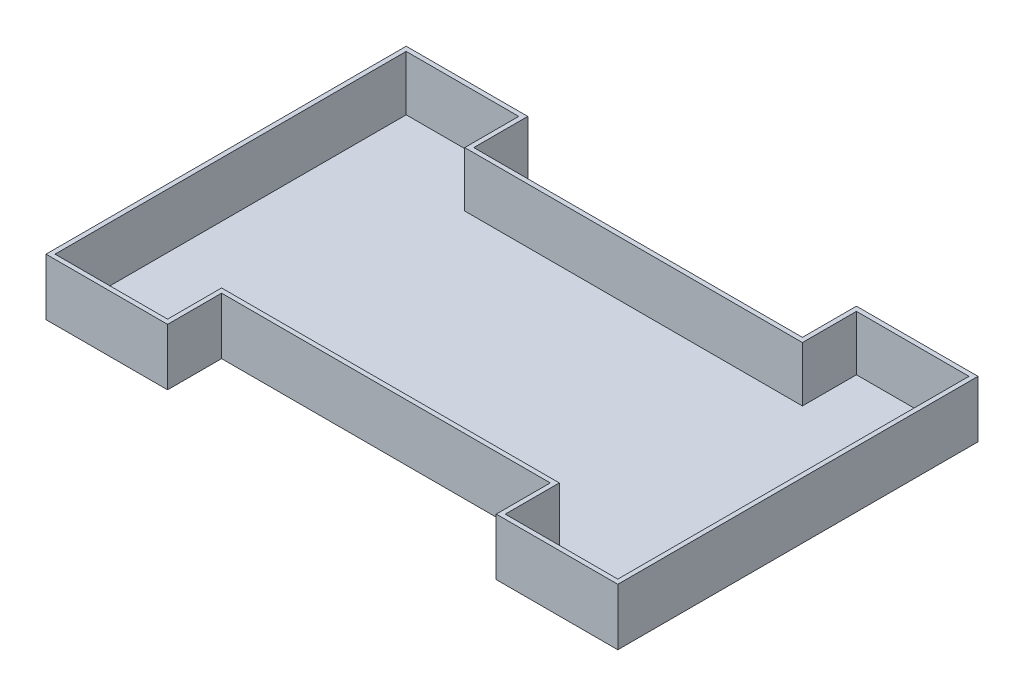
ISO-10303-21;
HEADER;
FILE_DESCRIPTION(('STEP AP214'),'2;1');
FILE_NAME('part.step','',(''),(''),'','','');
FILE_SCHEMA(('AUTOMOTIVE_DESIGN { 1 0 10303 214 1 1 1 1 }'));
ENDSEC;
DATA;
#1=APPLICATION_CONTEXT('core data for automotive mechanical design processes');
#2=APPLICATION_PROTOCOL_DEFINITION('international standard','automotive_design',2000,#1);
#3=PRODUCT_CONTEXT('',#1,'mechanical');
#4=PRODUCT('Part','Part','',(#3));
#5=PRODUCT_RELATED_PRODUCT_CATEGORY('part','',(#4));
#6=PRODUCT_DEFINITION_FORMATION('','',#4);
#7=PRODUCT_DEFINITION_CONTEXT('part definition',#1,'design');
#8=PRODUCT_DEFINITION('design','',#6,#7);
#9=PRODUCT_DEFINITION_SHAPE('','',#8);
#10=(LENGTH_UNIT() NAMED_UNIT(*) SI_UNIT(.MILLI.,.METRE.));
#11=(NAMED_UNIT(*) PLANE_ANGLE_UNIT() SI_UNIT($,.RADIAN.));
#12=(NAMED_UNIT(*) SI_UNIT($,.STERADIAN.) SOLID_ANGLE_UNIT());
#13=UNCERTAINTY_MEASURE_WITH_UNIT(LENGTH_MEASURE(1.E-05),#10,'distance_accuracy_value','');
#14=(GEOMETRIC_REPRESENTATION_CONTEXT(3) GLOBAL_UNCERTAINTY_ASSIGNED_CONTEXT((#13)) GLOBAL_UNIT_ASSIGNED_CONTEXT((#10,
#11,#12)) REPRESENTATION_CONTEXT('',''));
#15=CARTESIAN_POINT('',(0.,0.,0.));
#16=DIRECTION('',(0.,0.,1.));
#17=DIRECTION('',(1.,0.,0.));
#18=AXIS2_PLACEMENT_3D('',#15,#16,#17);
#19=CARTESIAN_POINT('',(403.225,2.54,254.));
#20=DIRECTION('',(0.,0.,-1.));
#21=DIRECTION('',(-1.,0.,0.));
#22=AXIS2_PLACEMENT_3D('',#19,#20,#21);
#23=PLANE('',#22);
#24=DIRECTION('',(1.,0.,0.));
#25=VECTOR('',#24,1.);
#26=CARTESIAN_POINT('',(403.225,0.,254.));
#27=LINE('',#26,#25);
#28=CARTESIAN_POINT('',(-403.225,0.,254.));
#29=VERTEX_POINT('',#28);
#30=CARTESIAN_POINT('',(-231.775,0.,254.));
#31=VERTEX_POINT('',#30);
#32=EDGE_CURVE('E366',#29,#31,#27,.T.);
#33=ORIENTED_EDGE('',*,*,#32,.T.);
#34=DIRECTION('',(0.,1.,0.));
#35=VECTOR('',#34,1.);
#36=CARTESIAN_POINT('',(-231.775,0.,254.));
#37=LINE('',#36,#35);
#38=CARTESIAN_POINT('',(-231.775,80.01,254.));
#39=VERTEX_POINT('',#38);
#40=EDGE_CURVE('E339',#31,#39,#37,.T.);
#41=ORIENTED_EDGE('',*,*,#40,.T.);
#42=DIRECTION('',(1.,0.,0.));
#43=VECTOR('',#42,1.);
#44=CARTESIAN_POINT('',(-403.225,80.01,254.));
#45=LINE('',#44,#43);
#46=CARTESIAN_POINT('',(-403.225,80.01,254.));
#47=VERTEX_POINT('',#46);
#48=EDGE_CURVE('E214',#47,#39,#45,.T.);
#49=ORIENTED_EDGE('',*,*,#48,.F.);
#50=DIRECTION('',(0.,-1.,0.));
#51=VECTOR('',#50,1.);
#52=CARTESIAN_POINT('',(-403.225,2.54,254.));
#53=LINE('',#52,#51);
#54=EDGE_CURVE('E11',#47,#29,#53,.T.);
#55=ORIENTED_EDGE('',*,*,#54,.T.);
#56=EDGE_LOOP('',(#33,#41,#49,#55));
#57=FACE_BOUND('',#56,.T.);
#58=ADVANCED_FACE('F39',(#57),#23,.F.);
#59=CARTESIAN_POINT('',(403.225,2.54,-254.));
#60=DIRECTION('',(0.,0.,1.));
#61=DIRECTION('',(1.,0.,0.));
#62=AXIS2_PLACEMENT_3D('',#59,#60,#61);
#63=PLANE('',#62);
#64=DIRECTION('',(-1.,0.,0.));
#65=VECTOR('',#64,1.);
#66=CARTESIAN_POINT('',(403.225,0.,-254.));
#67=LINE('',#66,#65);
#68=CARTESIAN_POINT('',(403.225,0.,-254.));
#69=VERTEX_POINT('',#68);
#70=CARTESIAN_POINT('',(231.775,0.,-254.));
#71=VERTEX_POINT('',#70);
#72=EDGE_CURVE('E372',#69,#71,#67,.T.);
#73=ORIENTED_EDGE('',*,*,#72,.T.);
#74=DIRECTION('',(0.,1.,0.));
#75=VECTOR('',#74,1.);
#76=CARTESIAN_POINT('',(231.775,0.,-254.));
#77=LINE('',#76,#75);
#78=CARTESIAN_POINT('',(231.775,80.01,-254.));
#79=VERTEX_POINT('',#78);
#80=EDGE_CURVE('E348',#71,#79,#77,.T.);
#81=ORIENTED_EDGE('',*,*,#80,.T.);
#82=DIRECTION('',(-1.,0.,0.));
#83=VECTOR('',#82,1.);
#84=CARTESIAN_POINT('',(403.225,80.01,-254.));
#85=LINE('',#84,#83);
#86=CARTESIAN_POINT('',(403.225,80.01,-254.));
#87=VERTEX_POINT('',#86);
#88=EDGE_CURVE('E310',#87,#79,#85,.T.);
#89=ORIENTED_EDGE('',*,*,#88,.F.);
#90=DIRECTION('',(0.,-1.,0.));
#91=VECTOR('',#90,1.);
#92=CARTESIAN_POINT('',(403.225,2.54,-254.));
#93=LINE('',#92,#91);
#94=EDGE_CURVE('E378',#87,#69,#93,.T.);
#95=ORIENTED_EDGE('',*,*,#94,.T.);
#96=EDGE_LOOP('',(#73,#81,#89,#95));
#97=FACE_BOUND('',#96,.T.);
#98=ADVANCED_FACE('F393',(#97),#63,.F.);
#99=CARTESIAN_POINT('',(-403.225,2.54,254.));
#100=DIRECTION('',(1.,0.,0.));
#101=DIRECTION('',(0.,0.,-1.));
#102=AXIS2_PLACEMENT_3D('',#99,#100,#101);
#103=PLANE('',#102);
#104=DIRECTION('',(0.,0.,1.));
#105=VECTOR('',#104,1.);
#106=CARTESIAN_POINT('',(-403.225,0.,254.));
#107=LINE('',#106,#105);
#108=CARTESIAN_POINT('',(-403.225,0.,-254.));
#109=VERTEX_POINT('',#108);
#110=EDGE_CURVE('E342',#109,#29,#107,.T.);
#111=ORIENTED_EDGE('',*,*,#110,.T.);
#112=ORIENTED_EDGE('',*,*,#54,.F.);
#113=DIRECTION('',(0.,0.,1.));
#114=VECTOR('',#113,1.);
#115=CARTESIAN_POINT('',(-403.225,80.01,-254.));
#116=LINE('',#115,#114);
#117=CARTESIAN_POINT('',(-403.225,80.01,-254.));
#118=VERTEX_POINT('',#117);
#119=EDGE_CURVE('E325',#118,#47,#116,.T.);
#120=ORIENTED_EDGE('',*,*,#119,.F.);
#121=DIRECTION('',(0.,-1.,0.));
#122=VECTOR('',#121,1.);
#123=CARTESIAN_POINT('',(-403.225,2.54,-254.));
#124=LINE('',#123,#122);
#125=EDGE_CURVE('E375',#118,#109,#124,.T.);
#126=ORIENTED_EDGE('',*,*,#125,.T.);
#127=EDGE_LOOP('',(#111,#112,#120,#126));
#128=FACE_BOUND('',#127,.T.);
#129=ADVANCED_FACE('F41',(#128),#103,.F.);
#130=DIRECTION('',(0.,-1.,0.));
#131=VECTOR('',#130,1.);
#132=CARTESIAN_POINT('',(403.225,2.54,254.));
#133=LINE('',#132,#131);
#134=CARTESIAN_POINT('',(403.225,80.01,254.));
#135=VERTEX_POINT('',#134);
#136=CARTESIAN_POINT('',(403.225,0.,254.));
#137=VERTEX_POINT('',#136);
#138=EDGE_CURVE('E47',#135,#137,#133,.T.);
#139=ORIENTED_EDGE('',*,*,#138,.F.);
#140=DIRECTION('',(1.,0.,0.));
#141=VECTOR('',#140,1.);
#142=CARTESIAN_POINT('',(231.775,80.01,254.));
#143=LINE('',#142,#141);
#144=CARTESIAN_POINT('',(231.775,80.01,254.));
#145=VERTEX_POINT('',#144);
#146=EDGE_CURVE('E304',#145,#135,#143,.T.);
#147=ORIENTED_EDGE('',*,*,#146,.F.);
#148=DIRECTION('',(0.,1.,0.));
#149=VECTOR('',#148,1.);
#150=CARTESIAN_POINT('',(231.775,0.,254.));
#151=LINE('',#150,#149);
#152=CARTESIAN_POINT('',(231.775,0.,254.));
#153=VERTEX_POINT('',#152);
#154=EDGE_CURVE('E345',#153,#145,#151,.T.);
#155=ORIENTED_EDGE('',*,*,#154,.F.);
#156=EDGE_CURVE('E365',#153,#137,#27,.T.);
#157=ORIENTED_EDGE('',*,*,#156,.T.);
#158=EDGE_LOOP('',(#139,#147,#155,#157));
#159=FACE_BOUND('',#158,.T.);
#160=ADVANCED_FACE('F399',(#159),#23,.F.);
#161=CARTESIAN_POINT('',(403.225,2.54,254.));
#162=DIRECTION('',(-1.,0.,0.));
#163=DIRECTION('',(0.,0.,1.));
#164=AXIS2_PLACEMENT_3D('',#161,#162,#163);
#165=PLANE('',#164);
#166=DIRECTION('',(0.,0.,-1.));
#167=VECTOR('',#166,1.);
#168=CARTESIAN_POINT('',(403.225,0.,254.));
#169=LINE('',#168,#167);
#170=EDGE_CURVE('E369',#137,#69,#169,.T.);
#171=ORIENTED_EDGE('',*,*,#170,.T.);
#172=ORIENTED_EDGE('',*,*,#94,.F.);
#173=DIRECTION('',(0.,0.,-1.));
#174=VECTOR('',#173,1.);
#175=CARTESIAN_POINT('',(403.225,80.01,254.));
#176=LINE('',#175,#174);
#177=EDGE_CURVE('E307',#135,#87,#176,.T.);
#178=ORIENTED_EDGE('',*,*,#177,.F.);
#179=ORIENTED_EDGE('',*,*,#138,.T.);
#180=EDGE_LOOP('',(#171,#172,#178,#179));
#181=FACE_BOUND('',#180,.T.);
#182=ADVANCED_FACE('F384',(#181),#165,.F.);
#183=ORIENTED_EDGE('',*,*,#125,.F.);
#184=DIRECTION('',(-1.,0.,0.));
#185=VECTOR('',#184,1.);
#186=CARTESIAN_POINT('',(-231.775,80.01,-254.));
#187=LINE('',#186,#185);
#188=CARTESIAN_POINT('',(-231.775,80.01,-254.));
#189=VERTEX_POINT('',#188);
#190=EDGE_CURVE('E322',#189,#118,#187,.T.);
#191=ORIENTED_EDGE('',*,*,#190,.F.);
#192=DIRECTION('',(0.,1.,0.));
#193=VECTOR('',#192,1.);
#194=CARTESIAN_POINT('',(-231.775,0.,-254.));
#195=LINE('',#194,#193);
#196=CARTESIAN_POINT('',(-231.775,0.,-254.));
#197=VERTEX_POINT('',#196);
#198=EDGE_CURVE('E351',#197,#189,#195,.T.);
#199=ORIENTED_EDGE('',*,*,#198,.F.);
#200=EDGE_CURVE('E371',#197,#109,#67,.T.);
#201=ORIENTED_EDGE('',*,*,#200,.T.);
#202=EDGE_LOOP('',(#183,#191,#199,#201));
#203=FACE_BOUND('',#202,.T.);
#204=ADVANCED_FACE('F418',(#203),#63,.F.);
#205=CARTESIAN_POINT('',(0.,0.,0.));
#206=DIRECTION('',(0.,1.,0.));
#207=DIRECTION('',(0.,0.,1.));
#208=AXIS2_PLACEMENT_3D('',#205,#206,#207);
#209=PLANE('',#208);
#210=DIRECTION('',(-1.,0.,0.));
#211=VECTOR('',#210,1.);
#212=CARTESIAN_POINT('',(-231.775,0.,177.8));
#213=LINE('',#212,#211);
#214=CARTESIAN_POINT('',(231.775,0.,177.8));
#215=VERTEX_POINT('',#214);
#216=CARTESIAN_POINT('',(-231.775,0.,177.8));
#217=VERTEX_POINT('',#216);
#218=EDGE_CURVE('E336',#215,#217,#213,.T.);
#219=ORIENTED_EDGE('',*,*,#218,.T.);
#220=DIRECTION('',(0.,0.,1.));
#221=VECTOR('',#220,1.);
#222=CARTESIAN_POINT('',(-231.775,0.,254.));
#223=LINE('',#222,#221);
#224=EDGE_CURVE('E329',#217,#31,#223,.T.);
#225=ORIENTED_EDGE('',*,*,#224,.T.);
#226=ORIENTED_EDGE('',*,*,#32,.F.);
#227=ORIENTED_EDGE('',*,*,#110,.F.);
#228=ORIENTED_EDGE('',*,*,#200,.F.);
#229=DIRECTION('',(0.,0.,1.));
#230=VECTOR('',#229,1.);
#231=CARTESIAN_POINT('',(-231.775,0.,-254.));
#232=LINE('',#231,#230);
#233=CARTESIAN_POINT('',(-231.775,0.,-177.8));
#234=VERTEX_POINT('',#233);
#235=EDGE_CURVE('E358',#197,#234,#232,.T.);
#236=ORIENTED_EDGE('',*,*,#235,.T.);
#237=DIRECTION('',(1.,0.,0.));
#238=VECTOR('',#237,1.);
#239=CARTESIAN_POINT('',(231.775,0.,-177.8));
#240=LINE('',#239,#238);
#241=CARTESIAN_POINT('',(231.775,0.,-177.8));
#242=VERTEX_POINT('',#241);
#243=EDGE_CURVE('E350',#234,#242,#240,.T.);
#244=ORIENTED_EDGE('',*,*,#243,.T.);
#245=DIRECTION('',(0.,0.,-1.));
#246=VECTOR('',#245,1.);
#247=CARTESIAN_POINT('',(231.775,0.,-254.));
#248=LINE('',#247,#246);
#249=EDGE_CURVE('E333',#242,#71,#248,.T.);
#250=ORIENTED_EDGE('',*,*,#249,.T.);
#251=ORIENTED_EDGE('',*,*,#72,.F.);
#252=ORIENTED_EDGE('',*,*,#170,.F.);
#253=ORIENTED_EDGE('',*,*,#156,.F.);
#254=DIRECTION('',(0.,0.,-1.));
#255=VECTOR('',#254,1.);
#256=CARTESIAN_POINT('',(231.775,0.,254.));
#257=LINE('',#256,#255);
#258=EDGE_CURVE('E332',#153,#215,#257,.T.);
#259=ORIENTED_EDGE('',*,*,#258,.T.);
#260=EDGE_LOOP('',(#219,#225,#226,#227,#228,#236,#244,#250,#251,#252,#253,#259));
#261=FACE_BOUND('',#260,.T.);
#262=ADVANCED_FACE('F390',(#261),#209,.F.);
#263=CARTESIAN_POINT('',(231.775,0.,-254.));
#264=DIRECTION('',(1.,0.,0.));
#265=DIRECTION('',(0.,0.,-1.));
#266=AXIS2_PLACEMENT_3D('',#263,#264,#265);
#267=PLANE('',#266);
#268=DIRECTION('',(0.,1.,0.));
#269=VECTOR('',#268,1.);
#270=CARTESIAN_POINT('',(231.775,0.,-177.8));
#271=LINE('',#270,#269);
#272=CARTESIAN_POINT('',(231.775,80.01,-177.8));
#273=VERTEX_POINT('',#272);
#274=EDGE_CURVE('E328',#242,#273,#271,.T.);
#275=ORIENTED_EDGE('',*,*,#274,.T.);
#276=DIRECTION('',(0.,0.,1.));
#277=VECTOR('',#276,1.);
#278=CARTESIAN_POINT('',(231.775,80.01,-254.));
#279=LINE('',#278,#277);
#280=EDGE_CURVE('E313',#79,#273,#279,.T.);
#281=ORIENTED_EDGE('',*,*,#280,.F.);
#282=ORIENTED_EDGE('',*,*,#80,.F.);
#283=ORIENTED_EDGE('',*,*,#249,.F.);
#284=EDGE_LOOP('',(#275,#281,#282,#283));
#285=FACE_BOUND('',#284,.T.);
#286=ADVANCED_FACE('F428',(#285),#267,.F.);
#287=CARTESIAN_POINT('',(231.775,0.,-177.8));
#288=DIRECTION('',(0.,0.,1.));
#289=DIRECTION('',(1.,0.,0.));
#290=AXIS2_PLACEMENT_3D('',#287,#288,#289);
#291=PLANE('',#290);
#292=DIRECTION('',(0.,1.,0.));
#293=VECTOR('',#292,1.);
#294=CARTESIAN_POINT('',(-231.775,0.,-177.8));
#295=LINE('',#294,#293);
#296=CARTESIAN_POINT('',(-231.775,80.01,-177.8));
#297=VERTEX_POINT('',#296);
#298=EDGE_CURVE('E353',#234,#297,#295,.T.);
#299=ORIENTED_EDGE('',*,*,#298,.T.);
#300=DIRECTION('',(-1.,0.,0.));
#301=VECTOR('',#300,1.);
#302=CARTESIAN_POINT('',(231.775,80.01,-177.8));
#303=LINE('',#302,#301);
#304=EDGE_CURVE('E316',#273,#297,#303,.T.);
#305=ORIENTED_EDGE('',*,*,#304,.F.);
#306=ORIENTED_EDGE('',*,*,#274,.F.);
#307=ORIENTED_EDGE('',*,*,#243,.F.);
#308=EDGE_LOOP('',(#299,#305,#306,#307));
#309=FACE_BOUND('',#308,.T.);
#310=ADVANCED_FACE('F426',(#309),#291,.F.);
#311=CARTESIAN_POINT('',(-231.775,0.,-254.));
#312=DIRECTION('',(-1.,0.,0.));
#313=DIRECTION('',(0.,0.,1.));
#314=AXIS2_PLACEMENT_3D('',#311,#312,#313);
#315=PLANE('',#314);
#316=ORIENTED_EDGE('',*,*,#198,.T.);
#317=DIRECTION('',(0.,0.,-1.));
#318=VECTOR('',#317,1.);
#319=CARTESIAN_POINT('',(-231.775,80.01,-177.8));
#320=LINE('',#319,#318);
#321=EDGE_CURVE('E319',#297,#189,#320,.T.);
#322=ORIENTED_EDGE('',*,*,#321,.F.);
#323=ORIENTED_EDGE('',*,*,#298,.F.);
#324=ORIENTED_EDGE('',*,*,#235,.F.);
#325=EDGE_LOOP('',(#316,#322,#323,#324));
#326=FACE_BOUND('',#325,.T.);
#327=ADVANCED_FACE('F424',(#326),#315,.F.);
#328=CARTESIAN_POINT('',(-231.775,0.,254.));
#329=DIRECTION('',(-1.,0.,0.));
#330=DIRECTION('',(0.,0.,1.));
#331=AXIS2_PLACEMENT_3D('',#328,#329,#330);
#332=PLANE('',#331);
#333=DIRECTION('',(0.,1.,0.));
#334=VECTOR('',#333,1.);
#335=CARTESIAN_POINT('',(-231.775,0.,177.8));
#336=LINE('',#335,#334);
#337=CARTESIAN_POINT('',(-231.775,80.01,177.8));
#338=VERTEX_POINT('',#337);
#339=EDGE_CURVE('E340',#217,#338,#336,.T.);
#340=ORIENTED_EDGE('',*,*,#339,.T.);
#341=DIRECTION('',(0.,0.,-1.));
#342=VECTOR('',#341,1.);
#343=CARTESIAN_POINT('',(-231.775,80.01,254.));
#344=LINE('',#343,#342);
#345=EDGE_CURVE('E295',#39,#338,#344,.T.);
#346=ORIENTED_EDGE('',*,*,#345,.F.);
#347=ORIENTED_EDGE('',*,*,#40,.F.);
#348=ORIENTED_EDGE('',*,*,#224,.F.);
#349=EDGE_LOOP('',(#340,#346,#347,#348));
#350=FACE_BOUND('',#349,.T.);
#351=ADVANCED_FACE('F409',(#350),#332,.F.);
#352=CARTESIAN_POINT('',(-231.775,0.,177.8));
#353=DIRECTION('',(0.,0.,-1.));
#354=DIRECTION('',(-1.,0.,0.));
#355=AXIS2_PLACEMENT_3D('',#352,#353,#354);
#356=PLANE('',#355);
#357=DIRECTION('',(0.,1.,0.));
#358=VECTOR('',#357,1.);
#359=CARTESIAN_POINT('',(231.775,0.,177.8));
#360=LINE('',#359,#358);
#361=CARTESIAN_POINT('',(231.775,80.01,177.8));
#362=VERTEX_POINT('',#361);
#363=EDGE_CURVE('E343',#215,#362,#360,.T.);
#364=ORIENTED_EDGE('',*,*,#363,.T.);
#365=DIRECTION('',(1.,0.,0.));
#366=VECTOR('',#365,1.);
#367=CARTESIAN_POINT('',(-231.775,80.01,177.8));
#368=LINE('',#367,#366);
#369=EDGE_CURVE('E298',#338,#362,#368,.T.);
#370=ORIENTED_EDGE('',*,*,#369,.F.);
#371=ORIENTED_EDGE('',*,*,#339,.F.);
#372=ORIENTED_EDGE('',*,*,#218,.F.);
#373=EDGE_LOOP('',(#364,#370,#371,#372));
#374=FACE_BOUND('',#373,.T.);
#375=ADVANCED_FACE('F405',(#374),#356,.F.);
#376=CARTESIAN_POINT('',(231.775,0.,254.));
#377=DIRECTION('',(1.,0.,0.));
#378=DIRECTION('',(0.,0.,-1.));
#379=AXIS2_PLACEMENT_3D('',#376,#377,#378);
#380=PLANE('',#379);
#381=ORIENTED_EDGE('',*,*,#154,.T.);
#382=DIRECTION('',(0.,0.,1.));
#383=VECTOR('',#382,1.);
#384=CARTESIAN_POINT('',(231.775,80.01,177.8));
#385=LINE('',#384,#383);
#386=EDGE_CURVE('E301',#362,#145,#385,.T.);
#387=ORIENTED_EDGE('',*,*,#386,.F.);
#388=ORIENTED_EDGE('',*,*,#363,.F.);
#389=ORIENTED_EDGE('',*,*,#258,.F.);
#390=EDGE_LOOP('',(#381,#387,#388,#389));
#391=FACE_BOUND('',#390,.T.);
#392=ADVANCED_FACE('F401',(#391),#380,.F.);
#393=CARTESIAN_POINT('',(0.,80.01,0.));
#394=DIRECTION('',(0.,1.,0.));
#395=DIRECTION('',(0.,0.,1.));
#396=AXIS2_PLACEMENT_3D('',#393,#394,#395);
#397=PLANE('',#396);
#398=ORIENTED_EDGE('',*,*,#48,.T.);
#399=ORIENTED_EDGE('',*,*,#345,.T.);
#400=ORIENTED_EDGE('',*,*,#369,.T.);
#401=ORIENTED_EDGE('',*,*,#386,.T.);
#402=ORIENTED_EDGE('',*,*,#146,.T.);
#403=ORIENTED_EDGE('',*,*,#177,.T.);
#404=ORIENTED_EDGE('',*,*,#88,.T.);
#405=ORIENTED_EDGE('',*,*,#280,.T.);
#406=ORIENTED_EDGE('',*,*,#304,.T.);
#407=ORIENTED_EDGE('',*,*,#321,.T.);
#408=ORIENTED_EDGE('',*,*,#190,.T.);
#409=ORIENTED_EDGE('',*,*,#119,.T.);
#410=EDGE_LOOP('',(#398,#399,#400,#401,#402,#403,#404,#405,#406,#407,#408,#409));
#411=FACE_BOUND('',#410,.T.);
#412=DIRECTION('',(-1.,0.,0.));
#413=VECTOR('',#412,1.);
#414=CARTESIAN_POINT('',(238.125,80.01,-171.45));
#415=LINE('',#414,#413);
#416=CARTESIAN_POINT('',(238.125,80.01,-171.45));
#417=VERTEX_POINT('',#416);
#418=CARTESIAN_POINT('',(-238.125,80.01,-171.45));
#419=VERTEX_POINT('',#418);
#420=EDGE_CURVE('E208',#417,#419,#415,.T.);
#421=ORIENTED_EDGE('',*,*,#420,.F.);
#422=DIRECTION('',(0.,0.,1.));
#423=VECTOR('',#422,1.);
#424=CARTESIAN_POINT('',(238.125,80.01,-247.65));
#425=LINE('',#424,#423);
#426=CARTESIAN_POINT('',(238.125,80.01,-247.65));
#427=VERTEX_POINT('',#426);
#428=EDGE_CURVE('E199',#427,#417,#425,.T.);
#429=ORIENTED_EDGE('',*,*,#428,.F.);
#430=DIRECTION('',(-1.,0.,0.));
#431=VECTOR('',#430,1.);
#432=CARTESIAN_POINT('',(396.875,80.01,-247.65));
#433=LINE('',#432,#431);
#434=CARTESIAN_POINT('',(396.875,80.01,-247.65));
#435=VERTEX_POINT('',#434);
#436=EDGE_CURVE('E241',#435,#427,#433,.T.);
#437=ORIENTED_EDGE('',*,*,#436,.F.);
#438=DIRECTION('',(0.,0.,-1.));
#439=VECTOR('',#438,1.);
#440=CARTESIAN_POINT('',(396.875,80.01,247.65));
#441=LINE('',#440,#439);
#442=CARTESIAN_POINT('',(396.875,80.01,247.65));
#443=VERTEX_POINT('',#442);
#444=EDGE_CURVE('E238',#443,#435,#441,.T.);
#445=ORIENTED_EDGE('',*,*,#444,.F.);
#446=DIRECTION('',(1.,0.,0.));
#447=VECTOR('',#446,1.);
#448=CARTESIAN_POINT('',(238.125,80.01,247.65));
#449=LINE('',#448,#447);
#450=CARTESIAN_POINT('',(238.125,80.01,247.65));
#451=VERTEX_POINT('',#450);
#452=EDGE_CURVE('E236',#451,#443,#449,.T.);
#453=ORIENTED_EDGE('',*,*,#452,.F.);
#454=DIRECTION('',(0.,0.,1.));
#455=VECTOR('',#454,1.);
#456=CARTESIAN_POINT('',(238.125,80.01,171.45));
#457=LINE('',#456,#455);
#458=CARTESIAN_POINT('',(238.125,80.01,171.45));
#459=VERTEX_POINT('',#458);
#460=EDGE_CURVE('E234',#459,#451,#457,.T.);
#461=ORIENTED_EDGE('',*,*,#460,.F.);
#462=DIRECTION('',(1.,0.,0.));
#463=VECTOR('',#462,1.);
#464=CARTESIAN_POINT('',(-238.125,80.01,171.45));
#465=LINE('',#464,#463);
#466=CARTESIAN_POINT('',(-238.125,80.01,171.45));
#467=VERTEX_POINT('',#466);
#468=EDGE_CURVE('E232',#467,#459,#465,.T.);
#469=ORIENTED_EDGE('',*,*,#468,.F.);
#470=DIRECTION('',(0.,0.,-1.));
#471=VECTOR('',#470,1.);
#472=CARTESIAN_POINT('',(-238.125,80.01,247.65));
#473=LINE('',#472,#471);
#474=CARTESIAN_POINT('',(-238.125,80.01,247.65));
#475=VERTEX_POINT('',#474);
#476=EDGE_CURVE('E230',#475,#467,#473,.T.);
#477=ORIENTED_EDGE('',*,*,#476,.F.);
#478=DIRECTION('',(1.,0.,0.));
#479=VECTOR('',#478,1.);
#480=CARTESIAN_POINT('',(-396.875,80.01,247.65));
#481=LINE('',#480,#479);
#482=CARTESIAN_POINT('',(-396.875,80.01,247.65));
#483=VERTEX_POINT('',#482);
#484=EDGE_CURVE('E228',#483,#475,#481,.T.);
#485=ORIENTED_EDGE('',*,*,#484,.F.);
#486=DIRECTION('',(0.,0.,1.));
#487=VECTOR('',#486,1.);
#488=CARTESIAN_POINT('',(-396.875,80.01,-247.65));
#489=LINE('',#488,#487);
#490=CARTESIAN_POINT('',(-396.875,80.01,-247.65));
#491=VERTEX_POINT('',#490);
#492=EDGE_CURVE('E226',#491,#483,#489,.T.);
#493=ORIENTED_EDGE('',*,*,#492,.F.);
#494=DIRECTION('',(-1.,0.,0.));
#495=VECTOR('',#494,1.);
#496=CARTESIAN_POINT('',(-238.125,80.01,-247.65));
#497=LINE('',#496,#495);
#498=CARTESIAN_POINT('',(-238.125,80.01,-247.65));
#499=VERTEX_POINT('',#498);
#500=EDGE_CURVE('E222',#499,#491,#497,.T.);
#501=ORIENTED_EDGE('',*,*,#500,.F.);
#502=DIRECTION('',(0.,0.,-1.));
#503=VECTOR('',#502,1.);
#504=CARTESIAN_POINT('',(-238.125,80.01,-171.45));
#505=LINE('',#504,#503);
#506=EDGE_CURVE('E220',#419,#499,#505,.T.);
#507=ORIENTED_EDGE('',*,*,#506,.F.);
#508=EDGE_LOOP('',(#421,#429,#437,#445,#453,#461,#469,#477,#485,#493,#501,#507));
#509=FACE_BOUND('',#508,.T.);
#510=ADVANCED_FACE('F218',(#411,#509),#397,.T.);
#511=CARTESIAN_POINT('',(238.125,80.01,-247.65));
#512=DIRECTION('',(1.,0.,0.));
#513=DIRECTION('',(0.,0.,-1.));
#514=AXIS2_PLACEMENT_3D('',#511,#512,#513);
#515=PLANE('',#514);
#516=DIRECTION('',(0.,0.,1.));
#517=VECTOR('',#516,1.);
#518=CARTESIAN_POINT('',(238.125,2.54,-247.65));
#519=LINE('',#518,#517);
#520=CARTESIAN_POINT('',(238.125,2.54,-247.65));
#521=VERTEX_POINT('',#520);
#522=CARTESIAN_POINT('',(238.125,2.54,-171.45));
#523=VERTEX_POINT('',#522);
#524=EDGE_CURVE('E54',#521,#523,#519,.T.);
#525=ORIENTED_EDGE('',*,*,#524,.F.);
#526=DIRECTION('',(0.,-1.,0.));
#527=VECTOR('',#526,1.);
#528=CARTESIAN_POINT('',(238.125,80.01,-247.65));
#529=LINE('',#528,#527);
#530=EDGE_CURVE('E204',#427,#521,#529,.T.);
#531=ORIENTED_EDGE('',*,*,#530,.F.);
#532=ORIENTED_EDGE('',*,*,#428,.T.);
#533=DIRECTION('',(0.,-1.,0.));
#534=VECTOR('',#533,1.);
#535=CARTESIAN_POINT('',(238.125,80.01,-171.45));
#536=LINE('',#535,#534);
#537=EDGE_CURVE('E202',#417,#523,#536,.T.);
#538=ORIENTED_EDGE('',*,*,#537,.T.);
#539=EDGE_LOOP('',(#525,#531,#532,#538));
#540=FACE_BOUND('',#539,.T.);
#541=ADVANCED_FACE('F201',(#540),#515,.T.);
#542=CARTESIAN_POINT('',(238.125,80.01,-171.45));
#543=DIRECTION('',(0.,0.,1.));
#544=DIRECTION('',(1.,0.,0.));
#545=AXIS2_PLACEMENT_3D('',#542,#543,#544);
#546=PLANE('',#545);
#547=DIRECTION('',(-1.,0.,0.));
#548=VECTOR('',#547,1.);
#549=CARTESIAN_POINT('',(238.125,2.54,-171.45));
#550=LINE('',#549,#548);
#551=CARTESIAN_POINT('',(-238.125,2.54,-171.45));
#552=VERTEX_POINT('',#551);
#553=EDGE_CURVE('E58',#523,#552,#550,.T.);
#554=ORIENTED_EDGE('',*,*,#553,.F.);
#555=ORIENTED_EDGE('',*,*,#537,.F.);
#556=ORIENTED_EDGE('',*,*,#420,.T.);
#557=DIRECTION('',(0.,-1.,0.));
#558=VECTOR('',#557,1.);
#559=CARTESIAN_POINT('',(-238.125,80.01,-171.45));
#560=LINE('',#559,#558);
#561=EDGE_CURVE('E215',#419,#552,#560,.T.);
#562=ORIENTED_EDGE('',*,*,#561,.T.);
#563=EDGE_LOOP('',(#554,#555,#556,#562));
#564=FACE_BOUND('',#563,.T.);
#565=ADVANCED_FACE('F212',(#564),#546,.T.);
#566=CARTESIAN_POINT('',(-238.125,80.01,-171.45));
#567=DIRECTION('',(-1.,0.,0.));
#568=DIRECTION('',(0.,0.,1.));
#569=AXIS2_PLACEMENT_3D('',#566,#567,#568);
#570=PLANE('',#569);
#571=DIRECTION('',(0.,0.,-1.));
#572=VECTOR('',#571,1.);
#573=CARTESIAN_POINT('',(-238.125,2.54,-171.45));
#574=LINE('',#573,#572);
#575=CARTESIAN_POINT('',(-238.125,2.54,-247.65));
#576=VERTEX_POINT('',#575);
#577=EDGE_CURVE('E245',#552,#576,#574,.T.);
#578=ORIENTED_EDGE('',*,*,#577,.F.);
#579=ORIENTED_EDGE('',*,*,#561,.F.);
#580=ORIENTED_EDGE('',*,*,#506,.T.);
#581=DIRECTION('',(0.,-1.,0.));
#582=VECTOR('',#581,1.);
#583=CARTESIAN_POINT('',(-238.125,80.01,-247.65));
#584=LINE('',#583,#582);
#585=EDGE_CURVE('E289',#499,#576,#584,.T.);
#586=ORIENTED_EDGE('',*,*,#585,.T.);
#587=EDGE_LOOP('',(#578,#579,#580,#586));
#588=FACE_BOUND('',#587,.T.);
#589=ADVANCED_FACE('F648',(#588),#570,.T.);
#590=CARTESIAN_POINT('',(-238.125,80.01,-247.65));
#591=DIRECTION('',(0.,0.,1.));
#592=DIRECTION('',(1.,0.,0.));
#593=AXIS2_PLACEMENT_3D('',#590,#591,#592);
#594=PLANE('',#593);
#595=DIRECTION('',(-1.,0.,0.));
#596=VECTOR('',#595,1.);
#597=CARTESIAN_POINT('',(-238.125,2.54,-247.65));
#598=LINE('',#597,#596);
#599=CARTESIAN_POINT('',(-396.875,2.54,-247.65));
#600=VERTEX_POINT('',#599);
#601=EDGE_CURVE('E247',#576,#600,#598,.T.);
#602=ORIENTED_EDGE('',*,*,#601,.F.);
#603=ORIENTED_EDGE('',*,*,#585,.F.);
#604=ORIENTED_EDGE('',*,*,#500,.T.);
#605=DIRECTION('',(0.,-1.,0.));
#606=VECTOR('',#605,1.);
#607=CARTESIAN_POINT('',(-396.875,80.01,-247.65));
#608=LINE('',#607,#606);
#609=EDGE_CURVE('E286',#491,#600,#608,.T.);
#610=ORIENTED_EDGE('',*,*,#609,.T.);
#611=EDGE_LOOP('',(#602,#603,#604,#610));
#612=FACE_BOUND('',#611,.T.);
#613=ADVANCED_FACE('F639',(#612),#594,.T.);
#614=CARTESIAN_POINT('',(-396.875,80.01,-247.65));
#615=DIRECTION('',(1.,0.,0.));
#616=DIRECTION('',(0.,0.,-1.));
#617=AXIS2_PLACEMENT_3D('',#614,#615,#616);
#618=PLANE('',#617);
#619=DIRECTION('',(0.,0.,1.));
#620=VECTOR('',#619,1.);
#621=CARTESIAN_POINT('',(-396.875,2.54,-247.65));
#622=LINE('',#621,#620);
#623=CARTESIAN_POINT('',(-396.875,2.54,247.65));
#624=VERTEX_POINT('',#623);
#625=EDGE_CURVE('E249',#600,#624,#622,.T.);
#626=ORIENTED_EDGE('',*,*,#625,.F.);
#627=ORIENTED_EDGE('',*,*,#609,.F.);
#628=ORIENTED_EDGE('',*,*,#492,.T.);
#629=DIRECTION('',(0.,-1.,0.));
#630=VECTOR('',#629,1.);
#631=CARTESIAN_POINT('',(-396.875,80.01,247.65));
#632=LINE('',#631,#630);
#633=EDGE_CURVE('E283',#483,#624,#632,.T.);
#634=ORIENTED_EDGE('',*,*,#633,.T.);
#635=EDGE_LOOP('',(#626,#627,#628,#634));
#636=FACE_BOUND('',#635,.T.);
#637=ADVANCED_FACE('F630',(#636),#618,.T.);
#638=CARTESIAN_POINT('',(-396.875,80.01,247.65));
#639=DIRECTION('',(0.,0.,-1.));
#640=DIRECTION('',(-1.,0.,0.));
#641=AXIS2_PLACEMENT_3D('',#638,#639,#640);
#642=PLANE('',#641);
#643=DIRECTION('',(1.,0.,0.));
#644=VECTOR('',#643,1.);
#645=CARTESIAN_POINT('',(-396.875,2.54,247.65));
#646=LINE('',#645,#644);
#647=CARTESIAN_POINT('',(-238.125,2.54,247.65));
#648=VERTEX_POINT('',#647);
#649=EDGE_CURVE('E251',#624,#648,#646,.T.);
#650=ORIENTED_EDGE('',*,*,#649,.F.);
#651=ORIENTED_EDGE('',*,*,#633,.F.);
#652=ORIENTED_EDGE('',*,*,#484,.T.);
#653=DIRECTION('',(0.,-1.,0.));
#654=VECTOR('',#653,1.);
#655=CARTESIAN_POINT('',(-238.125,80.01,247.65));
#656=LINE('',#655,#654);
#657=EDGE_CURVE('E280',#475,#648,#656,.T.);
#658=ORIENTED_EDGE('',*,*,#657,.T.);
#659=EDGE_LOOP('',(#650,#651,#652,#658));
#660=FACE_BOUND('',#659,.T.);
#661=ADVANCED_FACE('F621',(#660),#642,.T.);
#662=CARTESIAN_POINT('',(-238.125,80.01,247.65));
#663=DIRECTION('',(-1.,0.,0.));
#664=DIRECTION('',(0.,0.,1.));
#665=AXIS2_PLACEMENT_3D('',#662,#663,#664);
#666=PLANE('',#665);
#667=DIRECTION('',(0.,0.,-1.));
#668=VECTOR('',#667,1.);
#669=CARTESIAN_POINT('',(-238.125,2.54,247.65));
#670=LINE('',#669,#668);
#671=CARTESIAN_POINT('',(-238.125,2.54,171.45));
#672=VERTEX_POINT('',#671);
#673=EDGE_CURVE('E253',#648,#672,#670,.T.);
#674=ORIENTED_EDGE('',*,*,#673,.F.);
#675=ORIENTED_EDGE('',*,*,#657,.F.);
#676=ORIENTED_EDGE('',*,*,#476,.T.);
#677=DIRECTION('',(0.,-1.,0.));
#678=VECTOR('',#677,1.);
#679=CARTESIAN_POINT('',(-238.125,80.01,171.45));
#680=LINE('',#679,#678);
#681=EDGE_CURVE('E277',#467,#672,#680,.T.);
#682=ORIENTED_EDGE('',*,*,#681,.T.);
#683=EDGE_LOOP('',(#674,#675,#676,#682));
#684=FACE_BOUND('',#683,.T.);
#685=ADVANCED_FACE('F612',(#684),#666,.T.);
#686=CARTESIAN_POINT('',(-238.125,80.01,171.45));
#687=DIRECTION('',(0.,0.,-1.));
#688=DIRECTION('',(-1.,0.,0.));
#689=AXIS2_PLACEMENT_3D('',#686,#687,#688);
#690=PLANE('',#689);
#691=DIRECTION('',(1.,0.,0.));
#692=VECTOR('',#691,1.);
#693=CARTESIAN_POINT('',(-238.125,2.54,171.45));
#694=LINE('',#693,#692);
#695=CARTESIAN_POINT('',(238.125,2.54,171.45));
#696=VERTEX_POINT('',#695);
#697=EDGE_CURVE('E255',#672,#696,#694,.T.);
#698=ORIENTED_EDGE('',*,*,#697,.F.);
#699=ORIENTED_EDGE('',*,*,#681,.F.);
#700=ORIENTED_EDGE('',*,*,#468,.T.);
#701=DIRECTION('',(0.,-1.,0.));
#702=VECTOR('',#701,1.);
#703=CARTESIAN_POINT('',(238.125,80.01,171.45));
#704=LINE('',#703,#702);
#705=EDGE_CURVE('E274',#459,#696,#704,.T.);
#706=ORIENTED_EDGE('',*,*,#705,.T.);
#707=EDGE_LOOP('',(#698,#699,#700,#706));
#708=FACE_BOUND('',#707,.T.);
#709=ADVANCED_FACE('F603',(#708),#690,.T.);
#710=CARTESIAN_POINT('',(238.125,80.01,171.45));
#711=DIRECTION('',(1.,0.,0.));
#712=DIRECTION('',(0.,0.,-1.));
#713=AXIS2_PLACEMENT_3D('',#710,#711,#712);
#714=PLANE('',#713);
#715=DIRECTION('',(0.,0.,1.));
#716=VECTOR('',#715,1.);
#717=CARTESIAN_POINT('',(238.125,2.54,171.45));
#718=LINE('',#717,#716);
#719=CARTESIAN_POINT('',(238.125,2.54,247.65));
#720=VERTEX_POINT('',#719);
#721=EDGE_CURVE('E257',#696,#720,#718,.T.);
#722=ORIENTED_EDGE('',*,*,#721,.F.);
#723=ORIENTED_EDGE('',*,*,#705,.F.);
#724=ORIENTED_EDGE('',*,*,#460,.T.);
#725=DIRECTION('',(0.,-1.,0.));
#726=VECTOR('',#725,1.);
#727=CARTESIAN_POINT('',(238.125,80.01,247.65));
#728=LINE('',#727,#726);
#729=EDGE_CURVE('E271',#451,#720,#728,.T.);
#730=ORIENTED_EDGE('',*,*,#729,.T.);
#731=EDGE_LOOP('',(#722,#723,#724,#730));
#732=FACE_BOUND('',#731,.T.);
#733=ADVANCED_FACE('F594',(#732),#714,.T.);
#734=CARTESIAN_POINT('',(238.125,80.01,247.65));
#735=DIRECTION('',(0.,0.,-1.));
#736=DIRECTION('',(-1.,0.,0.));
#737=AXIS2_PLACEMENT_3D('',#734,#735,#736);
#738=PLANE('',#737);
#739=DIRECTION('',(1.,0.,0.));
#740=VECTOR('',#739,1.);
#741=CARTESIAN_POINT('',(238.125,2.54,247.65));
#742=LINE('',#741,#740);
#743=CARTESIAN_POINT('',(396.875,2.54,247.65));
#744=VERTEX_POINT('',#743);
#745=EDGE_CURVE('E259',#720,#744,#742,.T.);
#746=ORIENTED_EDGE('',*,*,#745,.F.);
#747=ORIENTED_EDGE('',*,*,#729,.F.);
#748=ORIENTED_EDGE('',*,*,#452,.T.);
#749=DIRECTION('',(0.,-1.,0.));
#750=VECTOR('',#749,1.);
#751=CARTESIAN_POINT('',(396.875,80.01,247.65));
#752=LINE('',#751,#750);
#753=EDGE_CURVE('E268',#443,#744,#752,.T.);
#754=ORIENTED_EDGE('',*,*,#753,.T.);
#755=EDGE_LOOP('',(#746,#747,#748,#754));
#756=FACE_BOUND('',#755,.T.);
#757=ADVANCED_FACE('F585',(#756),#738,.T.);
#758=CARTESIAN_POINT('',(396.875,80.01,247.65));
#759=DIRECTION('',(-1.,0.,0.));
#760=DIRECTION('',(0.,0.,1.));
#761=AXIS2_PLACEMENT_3D('',#758,#759,#760);
#762=PLANE('',#761);
#763=DIRECTION('',(0.,0.,-1.));
#764=VECTOR('',#763,1.);
#765=CARTESIAN_POINT('',(396.875,2.54,247.65));
#766=LINE('',#765,#764);
#767=CARTESIAN_POINT('',(396.875,2.54,-247.65));
#768=VERTEX_POINT('',#767);
#769=EDGE_CURVE('E261',#744,#768,#766,.T.);
#770=ORIENTED_EDGE('',*,*,#769,.F.);
#771=ORIENTED_EDGE('',*,*,#753,.F.);
#772=ORIENTED_EDGE('',*,*,#444,.T.);
#773=DIRECTION('',(0.,-1.,0.));
#774=VECTOR('',#773,1.);
#775=CARTESIAN_POINT('',(396.875,80.01,-247.65));
#776=LINE('',#775,#774);
#777=EDGE_CURVE('E265',#435,#768,#776,.T.);
#778=ORIENTED_EDGE('',*,*,#777,.T.);
#779=EDGE_LOOP('',(#770,#771,#772,#778));
#780=FACE_BOUND('',#779,.T.);
#781=ADVANCED_FACE('F576',(#780),#762,.T.);
#782=CARTESIAN_POINT('',(396.875,80.01,-247.65));
#783=DIRECTION('',(0.,0.,1.));
#784=DIRECTION('',(1.,0.,0.));
#785=AXIS2_PLACEMENT_3D('',#782,#783,#784);
#786=PLANE('',#785);
#787=DIRECTION('',(-1.,0.,0.));
#788=VECTOR('',#787,1.);
#789=CARTESIAN_POINT('',(396.875,2.54,-247.65));
#790=LINE('',#789,#788);
#791=EDGE_CURVE('E209',#768,#521,#790,.T.);
#792=ORIENTED_EDGE('',*,*,#791,.F.);
#793=ORIENTED_EDGE('',*,*,#777,.F.);
#794=ORIENTED_EDGE('',*,*,#436,.T.);
#795=ORIENTED_EDGE('',*,*,#530,.T.);
#796=EDGE_LOOP('',(#792,#793,#794,#795));
#797=FACE_BOUND('',#796,.T.);
#798=ADVANCED_FACE('F541',(#797),#786,.T.);
#799=CARTESIAN_POINT('',(0.,2.54,0.));
#800=DIRECTION('',(0.,1.,0.));
#801=DIRECTION('',(0.,0.,1.));
#802=AXIS2_PLACEMENT_3D('',#799,#800,#801);
#803=PLANE('',#802);
#804=ORIENTED_EDGE('',*,*,#524,.T.);
#805=ORIENTED_EDGE('',*,*,#553,.T.);
#806=ORIENTED_EDGE('',*,*,#577,.T.);
#807=ORIENTED_EDGE('',*,*,#601,.T.);
#808=ORIENTED_EDGE('',*,*,#625,.T.);
#809=ORIENTED_EDGE('',*,*,#649,.T.);
#810=ORIENTED_EDGE('',*,*,#673,.T.);
#811=ORIENTED_EDGE('',*,*,#697,.T.);
#812=ORIENTED_EDGE('',*,*,#721,.T.);
#813=ORIENTED_EDGE('',*,*,#745,.T.);
#814=ORIENTED_EDGE('',*,*,#769,.T.);
#815=ORIENTED_EDGE('',*,*,#791,.T.);
#816=EDGE_LOOP('',(#804,#805,#806,#807,#808,#809,#810,#811,#812,#813,#814,#815));
#817=FACE_BOUND('',#816,.T.);
#818=ADVANCED_FACE('F536',(#817),#803,.T.);
#819=CLOSED_SHELL('',(#58,#98,#129,#160,#182,#204,#262,#286,#310,#327,#351,#375,#392,#510,#541,
#565,#589,#613,#637,#661,#685,#709,#733,#757,#781,#798,#818));
#820=MANIFOLD_SOLID_BREP('B2',#819);
#821=ADVANCED_BREP_SHAPE_REPRESENTATION('',(#18,#820),#14);
#822=SHAPE_DEFINITION_REPRESENTATION(#9,#821);
ENDSEC;
END-ISO-10303-21;
